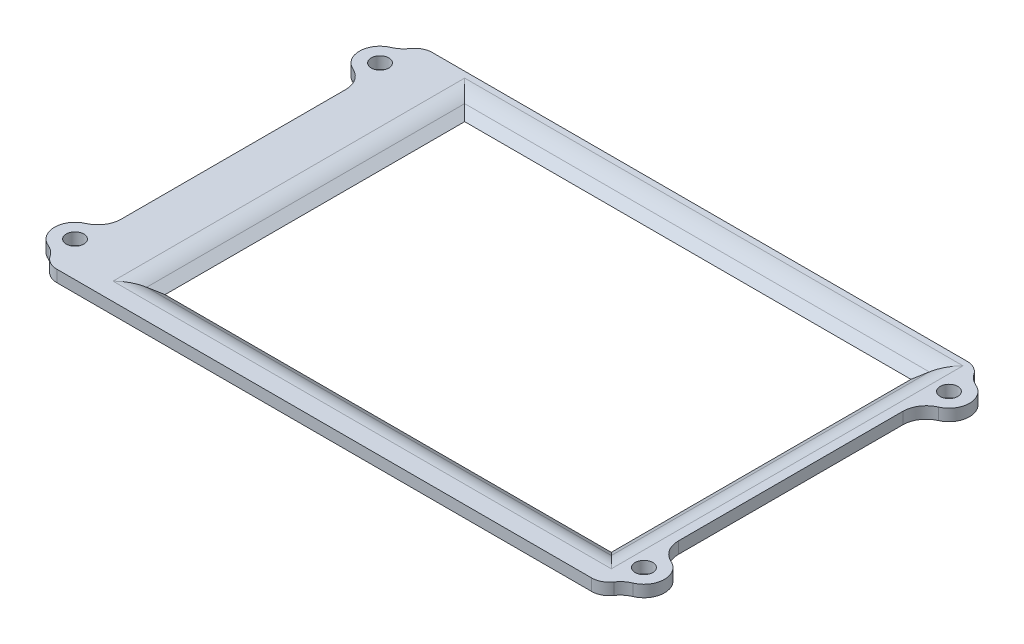
ISO-10303-21;
HEADER;
FILE_DESCRIPTION(('STEP AP214'),'2;1');
FILE_NAME('part.step','',(''),(''),'','','');
FILE_SCHEMA(('AUTOMOTIVE_DESIGN { 1 0 10303 214 1 1 1 1 }'));
ENDSEC;
DATA;
#1=APPLICATION_CONTEXT('core data for automotive mechanical design processes');
#2=APPLICATION_PROTOCOL_DEFINITION('international standard','automotive_design',2000,#1);
#3=PRODUCT_CONTEXT('',#1,'mechanical');
#4=PRODUCT('Part','Part','',(#3));
#5=PRODUCT_RELATED_PRODUCT_CATEGORY('part','',(#4));
#6=PRODUCT_DEFINITION_FORMATION('','',#4);
#7=PRODUCT_DEFINITION_CONTEXT('part definition',#1,'design');
#8=PRODUCT_DEFINITION('design','',#6,#7);
#9=PRODUCT_DEFINITION_SHAPE('','',#8);
#10=(LENGTH_UNIT() NAMED_UNIT(*) SI_UNIT(.MILLI.,.METRE.));
#11=(NAMED_UNIT(*) PLANE_ANGLE_UNIT() SI_UNIT($,.RADIAN.));
#12=(NAMED_UNIT(*) SI_UNIT($,.STERADIAN.) SOLID_ANGLE_UNIT());
#13=UNCERTAINTY_MEASURE_WITH_UNIT(LENGTH_MEASURE(1.E-05),#10,'distance_accuracy_value','');
#14=(GEOMETRIC_REPRESENTATION_CONTEXT(3) GLOBAL_UNCERTAINTY_ASSIGNED_CONTEXT((#13)) GLOBAL_UNIT_ASSIGNED_CONTEXT((#10,
#11,#12)) REPRESENTATION_CONTEXT('',''));
#15=CARTESIAN_POINT('',(0.,0.,0.));
#16=DIRECTION('',(0.,0.,1.));
#17=DIRECTION('',(1.,0.,0.));
#18=AXIS2_PLACEMENT_3D('',#15,#16,#17);
#19=CARTESIAN_POINT('',(47.5,2.,32.));
#20=DIRECTION('',(-1.,0.,0.));
#21=DIRECTION('',(0.,0.,1.));
#22=AXIS2_PLACEMENT_3D('',#19,#20,#21);
#23=PLANE('',#22);
#24=DIRECTION('',(0.,0.,-1.));
#25=VECTOR('',#24,1.);
#26=CARTESIAN_POINT('',(47.5,0.,32.));
#27=LINE('',#26,#25);
#28=CARTESIAN_POINT('',(47.5,0.,19.1261364575662));
#29=VERTEX_POINT('',#28);
#30=CARTESIAN_POINT('',(47.5,0.,-19.1261364575663));
#31=VERTEX_POINT('',#30);
#32=EDGE_CURVE('E242',#29,#31,#27,.T.);
#33=ORIENTED_EDGE('',*,*,#32,.T.);
#34=DIRECTION('',(0.,1.,0.));
#35=VECTOR('',#34,1.);
#36=CARTESIAN_POINT('',(47.5,2.,-19.1261364575663));
#37=LINE('',#36,#35);
#38=CARTESIAN_POINT('',(47.5,2.,-19.1261364575663));
#39=VERTEX_POINT('',#38);
#40=EDGE_CURVE('E265',#31,#39,#37,.T.);
#41=ORIENTED_EDGE('',*,*,#40,.T.);
#42=DIRECTION('',(0.,0.,-1.));
#43=VECTOR('',#42,1.);
#44=CARTESIAN_POINT('',(47.5,2.,32.));
#45=LINE('',#44,#43);
#46=CARTESIAN_POINT('',(47.5,2.,19.1261364575662));
#47=VERTEX_POINT('',#46);
#48=EDGE_CURVE('E466',#47,#39,#45,.T.);
#49=ORIENTED_EDGE('',*,*,#48,.F.);
#50=DIRECTION('',(0.,1.,0.));
#51=VECTOR('',#50,1.);
#52=CARTESIAN_POINT('',(47.5,2.,19.1261364575662));
#53=LINE('',#52,#51);
#54=EDGE_CURVE('E262',#47,#29,#53,.F.);
#55=ORIENTED_EDGE('',*,*,#54,.T.);
#56=EDGE_LOOP('',(#33,#41,#49,#55));
#57=FACE_BOUND('',#56,.T.);
#58=ADVANCED_FACE('F33',(#57),#23,.F.);
#59=CARTESIAN_POINT('',(-47.5,2.,32.));
#60=DIRECTION('',(1.,0.,0.));
#61=DIRECTION('',(0.,0.,-1.));
#62=AXIS2_PLACEMENT_3D('',#59,#60,#61);
#63=PLANE('',#62);
#64=DIRECTION('',(0.,0.,1.));
#65=VECTOR('',#64,1.);
#66=CARTESIAN_POINT('',(-47.5,0.,32.));
#67=LINE('',#66,#65);
#68=CARTESIAN_POINT('',(-47.5,0.,-19.1261364575662));
#69=VERTEX_POINT('',#68);
#70=CARTESIAN_POINT('',(-47.5,0.,19.1261364575662));
#71=VERTEX_POINT('',#70);
#72=EDGE_CURVE('E226',#69,#71,#67,.T.);
#73=ORIENTED_EDGE('',*,*,#72,.T.);
#74=DIRECTION('',(0.,1.,0.));
#75=VECTOR('',#74,1.);
#76=CARTESIAN_POINT('',(-47.5,2.,19.1261364575662));
#77=LINE('',#76,#75);
#78=CARTESIAN_POINT('',(-47.5,2.,19.1261364575662));
#79=VERTEX_POINT('',#78);
#80=EDGE_CURVE('E230',#71,#79,#77,.T.);
#81=ORIENTED_EDGE('',*,*,#80,.T.);
#82=DIRECTION('',(0.,0.,1.));
#83=VECTOR('',#82,1.);
#84=CARTESIAN_POINT('',(-47.5,2.,32.));
#85=LINE('',#84,#83);
#86=CARTESIAN_POINT('',(-47.5,2.,-19.1261364575662));
#87=VERTEX_POINT('',#86);
#88=EDGE_CURVE('E229',#87,#79,#85,.T.);
#89=ORIENTED_EDGE('',*,*,#88,.F.);
#90=DIRECTION('',(0.,1.,0.));
#91=VECTOR('',#90,1.);
#92=CARTESIAN_POINT('',(-47.5,2.,-19.1261364575662));
#93=LINE('',#92,#91);
#94=EDGE_CURVE('E212',#87,#69,#93,.F.);
#95=ORIENTED_EDGE('',*,*,#94,.T.);
#96=EDGE_LOOP('',(#73,#81,#89,#95));
#97=FACE_BOUND('',#96,.T.);
#98=ADVANCED_FACE('F224',(#97),#63,.F.);
#99=CARTESIAN_POINT('',(47.5,2.,32.));
#100=DIRECTION('',(0.,0.,-1.));
#101=DIRECTION('',(-1.,0.,0.));
#102=AXIS2_PLACEMENT_3D('',#99,#100,#101);
#103=PLANE('',#102);
#104=DIRECTION('',(1.,0.,0.));
#105=VECTOR('',#104,1.);
#106=CARTESIAN_POINT('',(47.5,0.,32.));
#107=LINE('',#106,#105);
#108=CARTESIAN_POINT('',(-45.593156546014,0.,32.));
#109=VERTEX_POINT('',#108);
#110=CARTESIAN_POINT('',(45.593156546014,0.,32.));
#111=VERTEX_POINT('',#110);
#112=EDGE_CURVE('E238',#109,#111,#107,.T.);
#113=ORIENTED_EDGE('',*,*,#112,.T.);
#114=DIRECTION('',(0.,-1.,0.));
#115=VECTOR('',#114,1.);
#116=CARTESIAN_POINT('',(45.593156546014,2.,32.));
#117=LINE('',#116,#115);
#118=CARTESIAN_POINT('',(45.593156546014,2.,32.));
#119=VERTEX_POINT('',#118);
#120=EDGE_CURVE('E336',#111,#119,#117,.F.);
#121=ORIENTED_EDGE('',*,*,#120,.T.);
#122=DIRECTION('',(1.,0.,0.));
#123=VECTOR('',#122,1.);
#124=CARTESIAN_POINT('',(47.5,2.,32.));
#125=LINE('',#124,#123);
#126=CARTESIAN_POINT('',(-45.593156546014,2.,32.));
#127=VERTEX_POINT('',#126);
#128=EDGE_CURVE('E464',#127,#119,#125,.T.);
#129=ORIENTED_EDGE('',*,*,#128,.F.);
#130=DIRECTION('',(0.,1.,0.));
#131=VECTOR('',#130,1.);
#132=CARTESIAN_POINT('',(-45.593156546014,2.,32.));
#133=LINE('',#132,#131);
#134=EDGE_CURVE('E333',#127,#109,#133,.F.);
#135=ORIENTED_EDGE('',*,*,#134,.T.);
#136=EDGE_LOOP('',(#113,#121,#129,#135));
#137=FACE_BOUND('',#136,.T.);
#138=ADVANCED_FACE('F533',(#137),#103,.F.);
#139=CARTESIAN_POINT('',(47.5,2.,-32.));
#140=DIRECTION('',(0.,0.,1.));
#141=DIRECTION('',(1.,0.,0.));
#142=AXIS2_PLACEMENT_3D('',#139,#140,#141);
#143=PLANE('',#142);
#144=DIRECTION('',(-1.,0.,0.));
#145=VECTOR('',#144,1.);
#146=CARTESIAN_POINT('',(47.5,2.,-32.));
#147=LINE('',#146,#145);
#148=CARTESIAN_POINT('',(45.593156546014,2.,-32.));
#149=VERTEX_POINT('',#148);
#150=CARTESIAN_POINT('',(-45.5931565460141,2.,-32.));
#151=VERTEX_POINT('',#150);
#152=EDGE_CURVE('E231',#149,#151,#147,.T.);
#153=ORIENTED_EDGE('',*,*,#152,.F.);
#154=DIRECTION('',(0.,1.,0.));
#155=VECTOR('',#154,1.);
#156=CARTESIAN_POINT('',(45.593156546014,2.,-32.));
#157=LINE('',#156,#155);
#158=CARTESIAN_POINT('',(45.593156546014,0.,-32.));
#159=VERTEX_POINT('',#158);
#160=EDGE_CURVE('E309',#149,#159,#157,.F.);
#161=ORIENTED_EDGE('',*,*,#160,.T.);
#162=DIRECTION('',(-1.,0.,0.));
#163=VECTOR('',#162,1.);
#164=CARTESIAN_POINT('',(47.5,0.,-32.));
#165=LINE('',#164,#163);
#166=CARTESIAN_POINT('',(-45.5931565460141,0.,-32.));
#167=VERTEX_POINT('',#166);
#168=EDGE_CURVE('E251',#159,#167,#165,.T.);
#169=ORIENTED_EDGE('',*,*,#168,.T.);
#170=DIRECTION('',(0.,-1.,0.));
#171=VECTOR('',#170,1.);
#172=CARTESIAN_POINT('',(-45.5931565460141,2.,-32.));
#173=LINE('',#172,#171);
#174=EDGE_CURVE('E307',#167,#151,#173,.F.);
#175=ORIENTED_EDGE('',*,*,#174,.T.);
#176=EDGE_LOOP('',(#153,#161,#169,#175));
#177=FACE_BOUND('',#176,.T.);
#178=ADVANCED_FACE('F411',(#177),#143,.F.);
#179=CARTESIAN_POINT('',(0.,2.,0.));
#180=DIRECTION('',(0.,1.,0.));
#181=DIRECTION('',(0.,0.,1.));
#182=AXIS2_PLACEMENT_3D('',#179,#180,#181);
#183=PLANE('',#182);
#184=DIRECTION('',(1.,0.,0.));
#185=VECTOR('',#184,1.);
#186=CARTESIAN_POINT('',(0.,2.,-30.9781512578093));
#187=LINE('',#186,#185);
#188=CARTESIAN_POINT('',(-39.0473551123345,2.,-30.9781512578093));
#189=VERTEX_POINT('',#188);
#190=CARTESIAN_POINT('',(45.9056327764554,2.,-30.9781512578093));
#191=VERTEX_POINT('',#190);
#192=EDGE_CURVE('E366',#189,#191,#187,.T.);
#193=ORIENTED_EDGE('',*,*,#192,.T.);
#194=DIRECTION('',(0.,0.,1.));
#195=VECTOR('',#194,1.);
#196=CARTESIAN_POINT('',(45.9056327764554,2.,0.));
#197=LINE('',#196,#195);
#198=CARTESIAN_POINT('',(45.9056327764554,2.,28.9748366309806));
#199=VERTEX_POINT('',#198);
#200=EDGE_CURVE('E368',#191,#199,#197,.T.);
#201=ORIENTED_EDGE('',*,*,#200,.T.);
#202=DIRECTION('',(-1.,0.,0.));
#203=VECTOR('',#202,1.);
#204=CARTESIAN_POINT('',(0.,2.,28.9748366309806));
#205=LINE('',#204,#203);
#206=CARTESIAN_POINT('',(-39.0473551123345,2.,28.9748366309806));
#207=VERTEX_POINT('',#206);
#208=EDGE_CURVE('E353',#199,#207,#205,.T.);
#209=ORIENTED_EDGE('',*,*,#208,.T.);
#210=DIRECTION('',(0.,0.,-1.));
#211=VECTOR('',#210,1.);
#212=CARTESIAN_POINT('',(-39.0473551123345,2.,0.));
#213=LINE('',#212,#211);
#214=EDGE_CURVE('E364',#207,#189,#213,.T.);
#215=ORIENTED_EDGE('',*,*,#214,.T.);
#216=EDGE_LOOP('',(#193,#201,#209,#215));
#217=FACE_BOUND('',#216,.T.);
#218=CARTESIAN_POINT('',(48.5,2.,-26.));
#219=DIRECTION('',(0.,1.,0.));
#220=DIRECTION('',(0.,0.,1.));
#221=AXIS2_PLACEMENT_3D('',#218,#219,#220);
#222=CIRCLE('',#221,1.5);
#223=CARTESIAN_POINT('',(48.5,2.,-24.5));
#224=VERTEX_POINT('',#223);
#225=EDGE_CURVE('E416',#224,#224,#222,.T.);
#226=ORIENTED_EDGE('',*,*,#225,.F.);
#227=EDGE_LOOP('',(#226));
#228=FACE_BOUND('',#227,.T.);
#229=CARTESIAN_POINT('',(-48.5,2.,-26.));
#230=DIRECTION('',(0.,1.,0.));
#231=DIRECTION('',(0.,0.,1.));
#232=AXIS2_PLACEMENT_3D('',#229,#230,#231);
#233=CIRCLE('',#232,1.5);
#234=CARTESIAN_POINT('',(-48.5,2.,-24.5));
#235=VERTEX_POINT('',#234);
#236=EDGE_CURVE('E420',#235,#235,#233,.T.);
#237=ORIENTED_EDGE('',*,*,#236,.F.);
#238=EDGE_LOOP('',(#237));
#239=FACE_BOUND('',#238,.T.);
#240=CARTESIAN_POINT('',(-48.5,2.,26.));
#241=DIRECTION('',(0.,1.,0.));
#242=DIRECTION('',(0.,0.,1.));
#243=AXIS2_PLACEMENT_3D('',#240,#241,#242);
#244=CIRCLE('',#243,1.5);
#245=CARTESIAN_POINT('',(-48.5,2.,27.5));
#246=VERTEX_POINT('',#245);
#247=EDGE_CURVE('E362',#246,#246,#244,.T.);
#248=ORIENTED_EDGE('',*,*,#247,.F.);
#249=EDGE_LOOP('',(#248));
#250=FACE_BOUND('',#249,.T.);
#251=CARTESIAN_POINT('',(48.5,2.,26.));
#252=DIRECTION('',(0.,1.,0.));
#253=DIRECTION('',(0.,0.,1.));
#254=AXIS2_PLACEMENT_3D('',#251,#252,#253);
#255=CIRCLE('',#254,1.5);
#256=CARTESIAN_POINT('',(48.5,2.,27.5));
#257=VERTEX_POINT('',#256);
#258=EDGE_CURVE('E427',#257,#257,#255,.T.);
#259=ORIENTED_EDGE('',*,*,#258,.F.);
#260=EDGE_LOOP('',(#259));
#261=FACE_BOUND('',#260,.T.);
#262=CARTESIAN_POINT('',(51.3928472915339,2.,-32.9196412152557));
#263=DIRECTION('',(0.,1.,0.));
#264=DIRECTION('',(0.,0.,1.));
#265=AXIS2_PLACEMENT_3D('',#262,#263,#264);
#266=CIRCLE('',#265,4.);
#267=CARTESIAN_POINT('',(49.8499954027158,2.,-29.2291659004527));
#268=VERTEX_POINT('',#267);
#269=CARTESIAN_POINT('',(48.078738294094,2.,-30.6798462351096));
#270=VERTEX_POINT('',#269);
#271=EDGE_CURVE('E295',#268,#270,#266,.F.);
#272=ORIENTED_EDGE('',*,*,#271,.T.);
#273=CARTESIAN_POINT('',(45.593156546014,2.,-29.));
#274=DIRECTION('',(0.,1.,0.));
#275=DIRECTION('',(0.,0.,1.));
#276=AXIS2_PLACEMENT_3D('',#273,#274,#275);
#277=CIRCLE('',#276,3.);
#278=EDGE_CURVE('E328',#270,#149,#277,.T.);
#279=ORIENTED_EDGE('',*,*,#278,.T.);
#280=ORIENTED_EDGE('',*,*,#152,.T.);
#281=CARTESIAN_POINT('',(-45.5931565460141,2.,-29.));
#282=DIRECTION('',(0.,1.,0.));
#283=DIRECTION('',(0.,0.,1.));
#284=AXIS2_PLACEMENT_3D('',#281,#282,#283);
#285=CIRCLE('',#284,3.);
#286=CARTESIAN_POINT('',(-48.078738294094,2.,-30.6798462351096));
#287=VERTEX_POINT('',#286);
#288=EDGE_CURVE('E322',#151,#287,#285,.T.);
#289=ORIENTED_EDGE('',*,*,#288,.T.);
#290=CARTESIAN_POINT('',(-51.3928472915339,2.,-32.9196412152557));
#291=DIRECTION('',(0.,1.,0.));
#292=DIRECTION('',(0.,0.,1.));
#293=AXIS2_PLACEMENT_3D('',#290,#291,#292);
#294=CIRCLE('',#293,4.);
#295=CARTESIAN_POINT('',(-49.8499954027158,2.,-29.2291659004527));
#296=VERTEX_POINT('',#295);
#297=EDGE_CURVE('E284',#287,#296,#294,.F.);
#298=ORIENTED_EDGE('',*,*,#297,.T.);
#299=CARTESIAN_POINT('',(-48.5,2.,-26.));
#300=DIRECTION('',(0.,1.,0.));
#301=DIRECTION('',(0.,0.,1.));
#302=AXIS2_PLACEMENT_3D('',#299,#300,#301);
#303=CIRCLE('',#302,3.5);
#304=CARTESIAN_POINT('',(-49.9,2.,-22.7921970135309));
#305=VERTEX_POINT('',#304);
#306=EDGE_CURVE('E244',#296,#305,#303,.T.);
#307=ORIENTED_EDGE('',*,*,#306,.T.);
#308=CARTESIAN_POINT('',(-51.5,2.,-19.1261364575662));
#309=DIRECTION('',(0.,1.,0.));
#310=DIRECTION('',(0.,0.,1.));
#311=AXIS2_PLACEMENT_3D('',#308,#309,#310);
#312=CIRCLE('',#311,4.);
#313=EDGE_CURVE('E218',#305,#87,#312,.F.);
#314=ORIENTED_EDGE('',*,*,#313,.T.);
#315=ORIENTED_EDGE('',*,*,#88,.T.);
#316=CARTESIAN_POINT('',(-51.5,2.,19.1261364575662));
#317=DIRECTION('',(0.,1.,0.));
#318=DIRECTION('',(0.,0.,1.));
#319=AXIS2_PLACEMENT_3D('',#316,#317,#318);
#320=CIRCLE('',#319,4.);
#321=CARTESIAN_POINT('',(-49.9,2.,22.7921970135309));
#322=VERTEX_POINT('',#321);
#323=EDGE_CURVE('E276',#79,#322,#320,.F.);
#324=ORIENTED_EDGE('',*,*,#323,.T.);
#325=CARTESIAN_POINT('',(-48.5,2.,26.));
#326=DIRECTION('',(0.,1.,0.));
#327=DIRECTION('',(0.,0.,1.));
#328=AXIS2_PLACEMENT_3D('',#325,#326,#327);
#329=CIRCLE('',#328,3.5);
#330=CARTESIAN_POINT('',(-49.8499954027159,2.,29.2291659004526));
#331=VERTEX_POINT('',#330);
#332=EDGE_CURVE('E459',#322,#331,#329,.T.);
#333=ORIENTED_EDGE('',*,*,#332,.T.);
#334=CARTESIAN_POINT('',(-51.3928472915339,2.,32.9196412152557));
#335=DIRECTION('',(0.,1.,0.));
#336=DIRECTION('',(0.,0.,1.));
#337=AXIS2_PLACEMENT_3D('',#334,#335,#336);
#338=CIRCLE('',#337,4.);
#339=CARTESIAN_POINT('',(-48.078738294094,2.,30.6798462351096));
#340=VERTEX_POINT('',#339);
#341=EDGE_CURVE('E219',#331,#340,#338,.F.);
#342=ORIENTED_EDGE('',*,*,#341,.T.);
#343=CARTESIAN_POINT('',(-45.593156546014,2.,29.));
#344=DIRECTION('',(0.,1.,0.));
#345=DIRECTION('',(0.,0.,1.));
#346=AXIS2_PLACEMENT_3D('',#343,#344,#345);
#347=CIRCLE('',#346,3.);
#348=EDGE_CURVE('E324',#340,#127,#347,.T.);
#349=ORIENTED_EDGE('',*,*,#348,.T.);
#350=ORIENTED_EDGE('',*,*,#128,.T.);
#351=CARTESIAN_POINT('',(45.593156546014,2.,29.));
#352=DIRECTION('',(0.,1.,0.));
#353=DIRECTION('',(0.,0.,1.));
#354=AXIS2_PLACEMENT_3D('',#351,#352,#353);
#355=CIRCLE('',#354,3.);
#356=CARTESIAN_POINT('',(48.078738294094,2.,30.6798462351096));
#357=VERTEX_POINT('',#356);
#358=EDGE_CURVE('E326',#119,#357,#355,.T.);
#359=ORIENTED_EDGE('',*,*,#358,.T.);
#360=CARTESIAN_POINT('',(51.3928472915339,2.,32.9196412152557));
#361=DIRECTION('',(0.,1.,0.));
#362=DIRECTION('',(0.,0.,1.));
#363=AXIS2_PLACEMENT_3D('',#360,#361,#362);
#364=CIRCLE('',#363,4.);
#365=CARTESIAN_POINT('',(49.8499954027158,2.,29.2291659004526));
#366=VERTEX_POINT('',#365);
#367=EDGE_CURVE('E302',#357,#366,#364,.F.);
#368=ORIENTED_EDGE('',*,*,#367,.T.);
#369=CARTESIAN_POINT('',(48.5,2.,26.));
#370=DIRECTION('',(0.,1.,0.));
#371=DIRECTION('',(0.,0.,1.));
#372=AXIS2_PLACEMENT_3D('',#369,#370,#371);
#373=CIRCLE('',#372,3.50000000000001);
#374=CARTESIAN_POINT('',(49.9,2.,22.7921970135309));
#375=VERTEX_POINT('',#374);
#376=EDGE_CURVE('E486',#366,#375,#373,.T.);
#377=ORIENTED_EDGE('',*,*,#376,.T.);
#378=CARTESIAN_POINT('',(51.5,2.,19.1261364575662));
#379=DIRECTION('',(0.,1.,0.));
#380=DIRECTION('',(0.,0.,1.));
#381=AXIS2_PLACEMENT_3D('',#378,#379,#380);
#382=CIRCLE('',#381,4.);
#383=EDGE_CURVE('E300',#375,#47,#382,.F.);
#384=ORIENTED_EDGE('',*,*,#383,.T.);
#385=ORIENTED_EDGE('',*,*,#48,.T.);
#386=CARTESIAN_POINT('',(51.5,2.,-19.1261364575663));
#387=DIRECTION('',(0.,1.,0.));
#388=DIRECTION('',(0.,0.,1.));
#389=AXIS2_PLACEMENT_3D('',#386,#387,#388);
#390=CIRCLE('',#389,4.);
#391=CARTESIAN_POINT('',(49.9,2.,-22.7921970135309));
#392=VERTEX_POINT('',#391);
#393=EDGE_CURVE('E289',#39,#392,#390,.F.);
#394=ORIENTED_EDGE('',*,*,#393,.T.);
#395=CARTESIAN_POINT('',(48.5,2.,-26.));
#396=DIRECTION('',(0.,1.,0.));
#397=DIRECTION('',(0.,0.,1.));
#398=AXIS2_PLACEMENT_3D('',#395,#396,#397);
#399=CIRCLE('',#398,3.5);
#400=EDGE_CURVE('E434',#392,#268,#399,.T.);
#401=ORIENTED_EDGE('',*,*,#400,.T.);
#402=EDGE_LOOP('',(#272,#279,#280,#289,#298,#307,#314,#315,#324,#333,#342,#349,#350,#359,#368,
#377,#384,#385,#394,#401));
#403=FACE_BOUND('',#402,.T.);
#404=ADVANCED_FACE('F408',(#217,#228,#239,#250,#261,#403),#183,.T.);
#405=CARTESIAN_POINT('',(0.,0.,0.));
#406=DIRECTION('',(0.,1.,0.));
#407=DIRECTION('',(0.,0.,1.));
#408=AXIS2_PLACEMENT_3D('',#405,#406,#407);
#409=PLANE('',#408);
#410=DIRECTION('',(-1.,0.,0.));
#411=VECTOR('',#410,1.);
#412=CARTESIAN_POINT('',(-34.4708611679396,0.,-26.5453612999301));
#413=LINE('',#412,#411);
#414=CARTESIAN_POINT('',(41.4728428185762,0.,-26.5453612999301));
#415=VERTEX_POINT('',#414);
#416=CARTESIAN_POINT('',(-34.6145651544554,0.,-26.5453612999301));
#417=VERTEX_POINT('',#416);
#418=EDGE_CURVE('E348',#415,#417,#413,.T.);
#419=ORIENTED_EDGE('',*,*,#418,.T.);
#420=DIRECTION('',(0.,0.,1.));
#421=VECTOR('',#420,1.);
#422=CARTESIAN_POINT('',(-34.6145651544554,0.,24.3983426865857));
#423=LINE('',#422,#421);
#424=CARTESIAN_POINT('',(-34.6145651544554,0.,24.5420466731015));
#425=VERTEX_POINT('',#424);
#426=EDGE_CURVE('E350',#417,#425,#423,.T.);
#427=ORIENTED_EDGE('',*,*,#426,.T.);
#428=DIRECTION('',(1.,0.,0.));
#429=VECTOR('',#428,1.);
#430=CARTESIAN_POINT('',(-34.4708611679396,0.,24.5420466731015));
#431=LINE('',#430,#429);
#432=CARTESIAN_POINT('',(41.4728428185762,0.,24.5420466731015));
#433=VERTEX_POINT('',#432);
#434=EDGE_CURVE('E343',#425,#433,#431,.T.);
#435=ORIENTED_EDGE('',*,*,#434,.T.);
#436=DIRECTION('',(0.,0.,-1.));
#437=VECTOR('',#436,1.);
#438=CARTESIAN_POINT('',(41.4728428185762,0.,24.3983426865857));
#439=LINE('',#438,#437);
#440=EDGE_CURVE('E346',#433,#415,#439,.T.);
#441=ORIENTED_EDGE('',*,*,#440,.T.);
#442=EDGE_LOOP('',(#419,#427,#435,#441));
#443=FACE_BOUND('',#442,.T.);
#444=CARTESIAN_POINT('',(48.5,0.,-26.));
#445=DIRECTION('',(0.,1.,0.));
#446=DIRECTION('',(0.,0.,1.));
#447=AXIS2_PLACEMENT_3D('',#444,#445,#446);
#448=CIRCLE('',#447,1.5);
#449=CARTESIAN_POINT('',(48.5,0.,-24.5));
#450=VERTEX_POINT('',#449);
#451=EDGE_CURVE('E497',#450,#450,#448,.T.);
#452=ORIENTED_EDGE('',*,*,#451,.T.);
#453=EDGE_LOOP('',(#452));
#454=FACE_BOUND('',#453,.T.);
#455=CARTESIAN_POINT('',(-48.5,0.,-26.));
#456=DIRECTION('',(0.,1.,0.));
#457=DIRECTION('',(0.,0.,1.));
#458=AXIS2_PLACEMENT_3D('',#455,#456,#457);
#459=CIRCLE('',#458,1.5);
#460=CARTESIAN_POINT('',(-48.5,0.,-24.5));
#461=VERTEX_POINT('',#460);
#462=EDGE_CURVE('E505',#461,#461,#459,.T.);
#463=ORIENTED_EDGE('',*,*,#462,.T.);
#464=EDGE_LOOP('',(#463));
#465=FACE_BOUND('',#464,.T.);
#466=CARTESIAN_POINT('',(-48.5,0.,26.));
#467=DIRECTION('',(0.,1.,0.));
#468=DIRECTION('',(0.,0.,1.));
#469=AXIS2_PLACEMENT_3D('',#466,#467,#468);
#470=CIRCLE('',#469,1.5);
#471=CARTESIAN_POINT('',(-48.5,0.,27.5));
#472=VERTEX_POINT('',#471);
#473=EDGE_CURVE('E501',#472,#472,#470,.T.);
#474=ORIENTED_EDGE('',*,*,#473,.T.);
#475=EDGE_LOOP('',(#474));
#476=FACE_BOUND('',#475,.T.);
#477=CARTESIAN_POINT('',(48.5,0.,26.));
#478=DIRECTION('',(0.,1.,0.));
#479=DIRECTION('',(0.,0.,1.));
#480=AXIS2_PLACEMENT_3D('',#477,#478,#479);
#481=CIRCLE('',#480,1.5);
#482=CARTESIAN_POINT('',(48.5,0.,27.5));
#483=VERTEX_POINT('',#482);
#484=EDGE_CURVE('E495',#483,#483,#481,.T.);
#485=ORIENTED_EDGE('',*,*,#484,.T.);
#486=EDGE_LOOP('',(#485));
#487=FACE_BOUND('',#486,.T.);
#488=ORIENTED_EDGE('',*,*,#168,.F.);
#489=CARTESIAN_POINT('',(45.593156546014,0.,-29.));
#490=DIRECTION('',(0.,1.,0.));
#491=DIRECTION('',(0.,0.,1.));
#492=AXIS2_PLACEMENT_3D('',#489,#490,#491);
#493=CIRCLE('',#492,3.);
#494=CARTESIAN_POINT('',(48.078738294094,0.,-30.6798462351096));
#495=VERTEX_POINT('',#494);
#496=EDGE_CURVE('E318',#159,#495,#493,.F.);
#497=ORIENTED_EDGE('',*,*,#496,.T.);
#498=CARTESIAN_POINT('',(51.3928472915339,0.,-32.9196412152557));
#499=DIRECTION('',(0.,1.,0.));
#500=DIRECTION('',(0.,0.,1.));
#501=AXIS2_PLACEMENT_3D('',#498,#499,#500);
#502=CIRCLE('',#501,4.);
#503=CARTESIAN_POINT('',(49.8499954027158,0.,-29.2291659004527));
#504=VERTEX_POINT('',#503);
#505=EDGE_CURVE('E293',#495,#504,#502,.T.);
#506=ORIENTED_EDGE('',*,*,#505,.T.);
#507=CARTESIAN_POINT('',(48.5,0.,-26.));
#508=DIRECTION('',(0.,1.,0.));
#509=DIRECTION('',(0.,0.,1.));
#510=AXIS2_PLACEMENT_3D('',#507,#508,#509);
#511=CIRCLE('',#510,3.5);
#512=CARTESIAN_POINT('',(49.9,0.,-22.7921970135309));
#513=VERTEX_POINT('',#512);
#514=EDGE_CURVE('E489',#504,#513,#511,.F.);
#515=ORIENTED_EDGE('',*,*,#514,.T.);
#516=CARTESIAN_POINT('',(51.5,0.,-19.1261364575663));
#517=DIRECTION('',(0.,1.,0.));
#518=DIRECTION('',(0.,0.,1.));
#519=AXIS2_PLACEMENT_3D('',#516,#517,#518);
#520=CIRCLE('',#519,4.);
#521=EDGE_CURVE('E291',#513,#31,#520,.T.);
#522=ORIENTED_EDGE('',*,*,#521,.T.);
#523=ORIENTED_EDGE('',*,*,#32,.F.);
#524=CARTESIAN_POINT('',(51.5,0.,19.1261364575662));
#525=DIRECTION('',(0.,1.,0.));
#526=DIRECTION('',(0.,0.,1.));
#527=AXIS2_PLACEMENT_3D('',#524,#525,#526);
#528=CIRCLE('',#527,4.);
#529=CARTESIAN_POINT('',(49.9,0.,22.7921970135309));
#530=VERTEX_POINT('',#529);
#531=EDGE_CURVE('E298',#29,#530,#528,.T.);
#532=ORIENTED_EDGE('',*,*,#531,.T.);
#533=CARTESIAN_POINT('',(48.5,0.,26.));
#534=DIRECTION('',(0.,1.,0.));
#535=DIRECTION('',(0.,0.,1.));
#536=AXIS2_PLACEMENT_3D('',#533,#534,#535);
#537=CIRCLE('',#536,3.50000000000001);
#538=CARTESIAN_POINT('',(49.8499954027158,0.,29.2291659004526));
#539=VERTEX_POINT('',#538);
#540=EDGE_CURVE('E480',#530,#539,#537,.F.);
#541=ORIENTED_EDGE('',*,*,#540,.T.);
#542=CARTESIAN_POINT('',(51.3928472915339,0.,32.9196412152557));
#543=DIRECTION('',(0.,1.,0.));
#544=DIRECTION('',(0.,0.,1.));
#545=AXIS2_PLACEMENT_3D('',#542,#543,#544);
#546=CIRCLE('',#545,4.);
#547=CARTESIAN_POINT('',(48.078738294094,0.,30.6798462351096));
#548=VERTEX_POINT('',#547);
#549=EDGE_CURVE('E304',#539,#548,#546,.T.);
#550=ORIENTED_EDGE('',*,*,#549,.T.);
#551=CARTESIAN_POINT('',(45.593156546014,0.,29.));
#552=DIRECTION('',(0.,1.,0.));
#553=DIRECTION('',(0.,0.,1.));
#554=AXIS2_PLACEMENT_3D('',#551,#552,#553);
#555=CIRCLE('',#554,3.);
#556=EDGE_CURVE('E316',#548,#111,#555,.F.);
#557=ORIENTED_EDGE('',*,*,#556,.T.);
#558=ORIENTED_EDGE('',*,*,#112,.F.);
#559=CARTESIAN_POINT('',(-45.593156546014,0.,29.));
#560=DIRECTION('',(0.,1.,0.));
#561=DIRECTION('',(0.,0.,1.));
#562=AXIS2_PLACEMENT_3D('',#559,#560,#561);
#563=CIRCLE('',#562,3.);
#564=CARTESIAN_POINT('',(-48.078738294094,0.,30.6798462351096));
#565=VERTEX_POINT('',#564);
#566=EDGE_CURVE('E314',#109,#565,#563,.F.);
#567=ORIENTED_EDGE('',*,*,#566,.T.);
#568=CARTESIAN_POINT('',(-51.3928472915339,0.,32.9196412152557));
#569=DIRECTION('',(0.,1.,0.));
#570=DIRECTION('',(0.,0.,1.));
#571=AXIS2_PLACEMENT_3D('',#568,#569,#570);
#572=CIRCLE('',#571,4.);
#573=CARTESIAN_POINT('',(-49.8499954027159,0.,29.2291659004526));
#574=VERTEX_POINT('',#573);
#575=EDGE_CURVE('E279',#565,#574,#572,.T.);
#576=ORIENTED_EDGE('',*,*,#575,.T.);
#577=CARTESIAN_POINT('',(-48.5,0.,26.));
#578=DIRECTION('',(0.,1.,0.));
#579=DIRECTION('',(0.,0.,1.));
#580=AXIS2_PLACEMENT_3D('',#577,#578,#579);
#581=CIRCLE('',#580,3.5);
#582=CARTESIAN_POINT('',(-49.9,0.,22.7921970135309));
#583=VERTEX_POINT('',#582);
#584=EDGE_CURVE('E457',#574,#583,#581,.F.);
#585=ORIENTED_EDGE('',*,*,#584,.T.);
#586=CARTESIAN_POINT('',(-51.5,0.,19.1261364575662));
#587=DIRECTION('',(0.,1.,0.));
#588=DIRECTION('',(0.,0.,1.));
#589=AXIS2_PLACEMENT_3D('',#586,#587,#588);
#590=CIRCLE('',#589,4.);
#591=EDGE_CURVE('E237',#583,#71,#590,.T.);
#592=ORIENTED_EDGE('',*,*,#591,.T.);
#593=ORIENTED_EDGE('',*,*,#72,.F.);
#594=CARTESIAN_POINT('',(-51.5,0.,-19.1261364575662));
#595=DIRECTION('',(0.,1.,0.));
#596=DIRECTION('',(0.,0.,1.));
#597=AXIS2_PLACEMENT_3D('',#594,#595,#596);
#598=CIRCLE('',#597,4.);
#599=CARTESIAN_POINT('',(-49.9,0.,-22.7921970135309));
#600=VERTEX_POINT('',#599);
#601=EDGE_CURVE('E208',#69,#600,#598,.T.);
#602=ORIENTED_EDGE('',*,*,#601,.T.);
#603=CARTESIAN_POINT('',(-48.5,0.,-26.));
#604=DIRECTION('',(0.,1.,0.));
#605=DIRECTION('',(0.,0.,1.));
#606=AXIS2_PLACEMENT_3D('',#603,#604,#605);
#607=CIRCLE('',#606,3.5);
#608=CARTESIAN_POINT('',(-49.8499954027158,0.,-29.2291659004527));
#609=VERTEX_POINT('',#608);
#610=EDGE_CURVE('E239',#600,#609,#607,.F.);
#611=ORIENTED_EDGE('',*,*,#610,.T.);
#612=CARTESIAN_POINT('',(-51.3928472915339,0.,-32.9196412152557));
#613=DIRECTION('',(0.,1.,0.));
#614=DIRECTION('',(0.,0.,1.));
#615=AXIS2_PLACEMENT_3D('',#612,#613,#614);
#616=CIRCLE('',#615,4.);
#617=CARTESIAN_POINT('',(-48.078738294094,0.,-30.6798462351096));
#618=VERTEX_POINT('',#617);
#619=EDGE_CURVE('E286',#609,#618,#616,.T.);
#620=ORIENTED_EDGE('',*,*,#619,.T.);
#621=CARTESIAN_POINT('',(-45.5931565460141,0.,-29.));
#622=DIRECTION('',(0.,1.,0.));
#623=DIRECTION('',(0.,0.,1.));
#624=AXIS2_PLACEMENT_3D('',#621,#622,#623);
#625=CIRCLE('',#624,3.);
#626=EDGE_CURVE('E312',#618,#167,#625,.F.);
#627=ORIENTED_EDGE('',*,*,#626,.T.);
#628=EDGE_LOOP('',(#488,#497,#506,#515,#522,#523,#532,#541,#550,#557,#558,#567,#576,#585,#592,
#593,#602,#611,#620,#627));
#629=FACE_BOUND('',#628,.T.);
#630=ADVANCED_FACE('F234',(#443,#454,#465,#476,#487,#629),#409,.F.);
#631=CARTESIAN_POINT('',(-48.5,-9.89949493661169,-26.));
#632=DIRECTION('',(0.,1.,0.));
#633=DIRECTION('',(0.,0.,1.));
#634=AXIS2_PLACEMENT_3D('',#631,#632,#633);
#635=CYLINDRICAL_SURFACE('',#634,3.5);
#636=ORIENTED_EDGE('',*,*,#610,.F.);
#637=DIRECTION('',(0.,1.,0.));
#638=VECTOR('',#637,1.);
#639=CARTESIAN_POINT('',(-49.9,-9.89949493661169,-22.7921970135309));
#640=LINE('',#639,#638);
#641=EDGE_CURVE('E213',#600,#305,#640,.T.);
#642=ORIENTED_EDGE('',*,*,#641,.T.);
#643=ORIENTED_EDGE('',*,*,#306,.F.);
#644=DIRECTION('',(0.,1.,0.));
#645=VECTOR('',#644,1.);
#646=CARTESIAN_POINT('',(-49.8499954027158,-9.89949493661169,-29.2291659004527));
#647=LINE('',#646,#645);
#648=EDGE_CURVE('E259',#296,#609,#647,.F.);
#649=ORIENTED_EDGE('',*,*,#648,.T.);
#650=EDGE_LOOP('',(#636,#642,#643,#649));
#651=FACE_BOUND('',#650,.T.);
#652=ADVANCED_FACE('F456',(#651),#635,.T.);
#653=CARTESIAN_POINT('',(-48.5,-9.89949493661169,26.));
#654=DIRECTION('',(0.,1.,0.));
#655=DIRECTION('',(0.,0.,1.));
#656=AXIS2_PLACEMENT_3D('',#653,#654,#655);
#657=CYLINDRICAL_SURFACE('',#656,3.5);
#658=ORIENTED_EDGE('',*,*,#332,.F.);
#659=DIRECTION('',(0.,1.,0.));
#660=VECTOR('',#659,1.);
#661=CARTESIAN_POINT('',(-49.9,-9.89949493661169,22.7921970135309));
#662=LINE('',#661,#660);
#663=EDGE_CURVE('E257',#322,#583,#662,.F.);
#664=ORIENTED_EDGE('',*,*,#663,.T.);
#665=ORIENTED_EDGE('',*,*,#584,.F.);
#666=DIRECTION('',(0.,1.,0.));
#667=VECTOR('',#666,1.);
#668=CARTESIAN_POINT('',(-49.8499954027159,-9.89949493661169,29.2291659004526));
#669=LINE('',#668,#667);
#670=EDGE_CURVE('E255',#574,#331,#669,.T.);
#671=ORIENTED_EDGE('',*,*,#670,.T.);
#672=EDGE_LOOP('',(#658,#664,#665,#671));
#673=FACE_BOUND('',#672,.T.);
#674=ADVANCED_FACE('F763',(#673),#657,.T.);
#675=CARTESIAN_POINT('',(48.5,-9.89949493661169,26.));
#676=DIRECTION('',(0.,1.,0.));
#677=DIRECTION('',(0.,0.,1.));
#678=AXIS2_PLACEMENT_3D('',#675,#676,#677);
#679=CYLINDRICAL_SURFACE('',#678,3.50000000000001);
#680=ORIENTED_EDGE('',*,*,#540,.F.);
#681=DIRECTION('',(0.,1.,0.));
#682=VECTOR('',#681,1.);
#683=CARTESIAN_POINT('',(49.9,-9.89949493661169,22.7921970135309));
#684=LINE('',#683,#682);
#685=EDGE_CURVE('E274',#530,#375,#684,.T.);
#686=ORIENTED_EDGE('',*,*,#685,.T.);
#687=ORIENTED_EDGE('',*,*,#376,.F.);
#688=DIRECTION('',(0.,1.,0.));
#689=VECTOR('',#688,1.);
#690=CARTESIAN_POINT('',(49.8499954027158,-9.89949493661169,29.2291659004526));
#691=LINE('',#690,#689);
#692=EDGE_CURVE('E272',#366,#539,#691,.F.);
#693=ORIENTED_EDGE('',*,*,#692,.T.);
#694=EDGE_LOOP('',(#680,#686,#687,#693));
#695=FACE_BOUND('',#694,.T.);
#696=ADVANCED_FACE('F483',(#695),#679,.T.);
#697=CARTESIAN_POINT('',(48.5,-9.89949493661169,-26.));
#698=DIRECTION('',(0.,1.,0.));
#699=DIRECTION('',(0.,0.,1.));
#700=AXIS2_PLACEMENT_3D('',#697,#698,#699);
#701=CYLINDRICAL_SURFACE('',#700,3.5);
#702=ORIENTED_EDGE('',*,*,#400,.F.);
#703=DIRECTION('',(0.,1.,0.));
#704=VECTOR('',#703,1.);
#705=CARTESIAN_POINT('',(49.9,-9.89949493661169,-22.7921970135309));
#706=LINE('',#705,#704);
#707=EDGE_CURVE('E270',#392,#513,#706,.F.);
#708=ORIENTED_EDGE('',*,*,#707,.T.);
#709=ORIENTED_EDGE('',*,*,#514,.F.);
#710=DIRECTION('',(0.,1.,0.));
#711=VECTOR('',#710,1.);
#712=CARTESIAN_POINT('',(49.8499954027158,-9.89949493661169,-29.2291659004527));
#713=LINE('',#712,#711);
#714=EDGE_CURVE('E268',#504,#268,#713,.T.);
#715=ORIENTED_EDGE('',*,*,#714,.T.);
#716=EDGE_LOOP('',(#702,#708,#709,#715));
#717=FACE_BOUND('',#716,.T.);
#718=ADVANCED_FACE('F545',(#717),#701,.T.);
#719=CARTESIAN_POINT('',(-51.5,-9.89949493661169,19.1261364575662));
#720=DIRECTION('',(0.,1.,0.));
#721=DIRECTION('',(0.,0.,1.));
#722=AXIS2_PLACEMENT_3D('',#719,#720,#721);
#723=CYLINDRICAL_SURFACE('',#722,4.);
#724=ORIENTED_EDGE('',*,*,#591,.F.);
#725=ORIENTED_EDGE('',*,*,#663,.F.);
#726=ORIENTED_EDGE('',*,*,#323,.F.);
#727=ORIENTED_EDGE('',*,*,#80,.F.);
#728=EDGE_LOOP('',(#724,#725,#726,#727));
#729=FACE_BOUND('',#728,.T.);
#730=ADVANCED_FACE('F541',(#729),#723,.F.);
#731=CARTESIAN_POINT('',(-51.3928472915339,-9.89949493661169,32.9196412152557));
#732=DIRECTION('',(0.,1.,0.));
#733=DIRECTION('',(0.,0.,1.));
#734=AXIS2_PLACEMENT_3D('',#731,#732,#733);
#735=CYLINDRICAL_SURFACE('',#734,4.);
#736=ORIENTED_EDGE('',*,*,#575,.F.);
#737=DIRECTION('',(0.,1.,0.));
#738=VECTOR('',#737,1.);
#739=CARTESIAN_POINT('',(-48.078738294094,-9.89949493661169,30.6798462351096));
#740=LINE('',#739,#738);
#741=EDGE_CURVE('E338',#565,#340,#740,.T.);
#742=ORIENTED_EDGE('',*,*,#741,.T.);
#743=ORIENTED_EDGE('',*,*,#341,.F.);
#744=ORIENTED_EDGE('',*,*,#670,.F.);
#745=EDGE_LOOP('',(#736,#742,#743,#744));
#746=FACE_BOUND('',#745,.T.);
#747=ADVANCED_FACE('F544',(#746),#735,.F.);
#748=CARTESIAN_POINT('',(-51.5,-9.89949493661169,-19.1261364575662));
#749=DIRECTION('',(0.,1.,0.));
#750=DIRECTION('',(0.,0.,1.));
#751=AXIS2_PLACEMENT_3D('',#748,#749,#750);
#752=CYLINDRICAL_SURFACE('',#751,4.);
#753=ORIENTED_EDGE('',*,*,#313,.F.);
#754=ORIENTED_EDGE('',*,*,#641,.F.);
#755=ORIENTED_EDGE('',*,*,#601,.F.);
#756=ORIENTED_EDGE('',*,*,#94,.F.);
#757=EDGE_LOOP('',(#753,#754,#755,#756));
#758=FACE_BOUND('',#757,.T.);
#759=ADVANCED_FACE('F211',(#758),#752,.F.);
#760=CARTESIAN_POINT('',(-51.3928472915339,-9.89949493661169,-32.9196412152557));
#761=DIRECTION('',(0.,-1.,0.));
#762=DIRECTION('',(0.,0.,-1.));
#763=AXIS2_PLACEMENT_3D('',#760,#761,#762);
#764=CYLINDRICAL_SURFACE('',#763,4.);
#765=ORIENTED_EDGE('',*,*,#297,.F.);
#766=DIRECTION('',(0.,-1.,0.));
#767=VECTOR('',#766,1.);
#768=CARTESIAN_POINT('',(-48.078738294094,-9.89949493661169,-30.6798462351096));
#769=LINE('',#768,#767);
#770=EDGE_CURVE('E340',#287,#618,#769,.T.);
#771=ORIENTED_EDGE('',*,*,#770,.T.);
#772=ORIENTED_EDGE('',*,*,#619,.F.);
#773=ORIENTED_EDGE('',*,*,#648,.F.);
#774=EDGE_LOOP('',(#765,#771,#772,#773));
#775=FACE_BOUND('',#774,.T.);
#776=ADVANCED_FACE('F451',(#775),#764,.F.);
#777=CARTESIAN_POINT('',(51.5,-9.89949493661169,-19.1261364575663));
#778=DIRECTION('',(0.,1.,0.));
#779=DIRECTION('',(0.,0.,1.));
#780=AXIS2_PLACEMENT_3D('',#777,#778,#779);
#781=CYLINDRICAL_SURFACE('',#780,4.);
#782=ORIENTED_EDGE('',*,*,#521,.F.);
#783=ORIENTED_EDGE('',*,*,#707,.F.);
#784=ORIENTED_EDGE('',*,*,#393,.F.);
#785=ORIENTED_EDGE('',*,*,#40,.F.);
#786=EDGE_LOOP('',(#782,#783,#784,#785));
#787=FACE_BOUND('',#786,.T.);
#788=ADVANCED_FACE('F554',(#787),#781,.F.);
#789=CARTESIAN_POINT('',(51.3928472915339,-9.89949493661169,-32.9196412152557));
#790=DIRECTION('',(0.,1.,0.));
#791=DIRECTION('',(0.,0.,1.));
#792=AXIS2_PLACEMENT_3D('',#789,#790,#791);
#793=CYLINDRICAL_SURFACE('',#792,4.);
#794=ORIENTED_EDGE('',*,*,#505,.F.);
#795=DIRECTION('',(0.,1.,0.));
#796=VECTOR('',#795,1.);
#797=CARTESIAN_POINT('',(48.078738294094,-9.89949493661169,-30.6798462351096));
#798=LINE('',#797,#796);
#799=EDGE_CURVE('E320',#495,#270,#798,.T.);
#800=ORIENTED_EDGE('',*,*,#799,.T.);
#801=ORIENTED_EDGE('',*,*,#271,.F.);
#802=ORIENTED_EDGE('',*,*,#714,.F.);
#803=EDGE_LOOP('',(#794,#800,#801,#802));
#804=FACE_BOUND('',#803,.T.);
#805=ADVANCED_FACE('F557',(#804),#793,.F.);
#806=CARTESIAN_POINT('',(51.5,-9.89949493661169,19.1261364575662));
#807=DIRECTION('',(0.,1.,0.));
#808=DIRECTION('',(0.,0.,1.));
#809=AXIS2_PLACEMENT_3D('',#806,#807,#808);
#810=CYLINDRICAL_SURFACE('',#809,4.);
#811=ORIENTED_EDGE('',*,*,#383,.F.);
#812=ORIENTED_EDGE('',*,*,#685,.F.);
#813=ORIENTED_EDGE('',*,*,#531,.F.);
#814=ORIENTED_EDGE('',*,*,#54,.F.);
#815=EDGE_LOOP('',(#811,#812,#813,#814));
#816=FACE_BOUND('',#815,.T.);
#817=ADVANCED_FACE('F476',(#816),#810,.F.);
#818=CARTESIAN_POINT('',(51.3928472915339,-9.89949493661169,32.9196412152557));
#819=DIRECTION('',(0.,-1.,0.));
#820=DIRECTION('',(0.,0.,-1.));
#821=AXIS2_PLACEMENT_3D('',#818,#819,#820);
#822=CYLINDRICAL_SURFACE('',#821,4.);
#823=ORIENTED_EDGE('',*,*,#367,.F.);
#824=DIRECTION('',(0.,-1.,0.));
#825=VECTOR('',#824,1.);
#826=CARTESIAN_POINT('',(48.078738294094,-9.89949493661169,30.6798462351096));
#827=LINE('',#826,#825);
#828=EDGE_CURVE('E330',#357,#548,#827,.T.);
#829=ORIENTED_EDGE('',*,*,#828,.T.);
#830=ORIENTED_EDGE('',*,*,#549,.F.);
#831=ORIENTED_EDGE('',*,*,#692,.F.);
#832=EDGE_LOOP('',(#823,#829,#830,#831));
#833=FACE_BOUND('',#832,.T.);
#834=ADVANCED_FACE('F563',(#833),#822,.F.);
#835=CARTESIAN_POINT('',(45.593156546014,-9.89949493661169,-29.));
#836=DIRECTION('',(0.,1.,0.));
#837=DIRECTION('',(0.,0.,1.));
#838=AXIS2_PLACEMENT_3D('',#835,#836,#837);
#839=CYLINDRICAL_SURFACE('',#838,3.);
#840=ORIENTED_EDGE('',*,*,#278,.F.);
#841=ORIENTED_EDGE('',*,*,#799,.F.);
#842=ORIENTED_EDGE('',*,*,#496,.F.);
#843=ORIENTED_EDGE('',*,*,#160,.F.);
#844=EDGE_LOOP('',(#840,#841,#842,#843));
#845=FACE_BOUND('',#844,.T.);
#846=ADVANCED_FACE('F440',(#845),#839,.T.);
#847=CARTESIAN_POINT('',(45.593156546014,-9.89949493661169,29.));
#848=DIRECTION('',(0.,-1.,0.));
#849=DIRECTION('',(0.,0.,-1.));
#850=AXIS2_PLACEMENT_3D('',#847,#848,#849);
#851=CYLINDRICAL_SURFACE('',#850,3.);
#852=ORIENTED_EDGE('',*,*,#358,.F.);
#853=ORIENTED_EDGE('',*,*,#120,.F.);
#854=ORIENTED_EDGE('',*,*,#556,.F.);
#855=ORIENTED_EDGE('',*,*,#828,.F.);
#856=EDGE_LOOP('',(#852,#853,#854,#855));
#857=FACE_BOUND('',#856,.T.);
#858=ADVANCED_FACE('F569',(#857),#851,.T.);
#859=CARTESIAN_POINT('',(-45.593156546014,-9.89949493661169,29.));
#860=DIRECTION('',(0.,1.,0.));
#861=DIRECTION('',(0.,0.,1.));
#862=AXIS2_PLACEMENT_3D('',#859,#860,#861);
#863=CYLINDRICAL_SURFACE('',#862,3.);
#864=ORIENTED_EDGE('',*,*,#348,.F.);
#865=ORIENTED_EDGE('',*,*,#741,.F.);
#866=ORIENTED_EDGE('',*,*,#566,.F.);
#867=ORIENTED_EDGE('',*,*,#134,.F.);
#868=EDGE_LOOP('',(#864,#865,#866,#867));
#869=FACE_BOUND('',#868,.T.);
#870=ADVANCED_FACE('F572',(#869),#863,.T.);
#871=CARTESIAN_POINT('',(-45.5931565460141,-9.89949493661169,-29.));
#872=DIRECTION('',(0.,-1.,0.));
#873=DIRECTION('',(0.,0.,-1.));
#874=AXIS2_PLACEMENT_3D('',#871,#872,#873);
#875=CYLINDRICAL_SURFACE('',#874,3.);
#876=ORIENTED_EDGE('',*,*,#288,.F.);
#877=ORIENTED_EDGE('',*,*,#174,.F.);
#878=ORIENTED_EDGE('',*,*,#626,.F.);
#879=ORIENTED_EDGE('',*,*,#770,.F.);
#880=EDGE_LOOP('',(#876,#877,#878,#879));
#881=FACE_BOUND('',#880,.T.);
#882=ADVANCED_FACE('F448',(#881),#875,.T.);
#883=CARTESIAN_POINT('',(48.5,0.,26.));
#884=DIRECTION('',(0.,1.,0.));
#885=DIRECTION('',(0.,0.,1.));
#886=AXIS2_PLACEMENT_3D('',#883,#884,#885);
#887=CYLINDRICAL_SURFACE('',#886,1.5);
#888=ORIENTED_EDGE('',*,*,#484,.F.);
#889=EDGE_LOOP('',(#888));
#890=FACE_BOUND('',#889,.T.);
#891=ORIENTED_EDGE('',*,*,#258,.T.);
#892=EDGE_LOOP('',(#891));
#893=FACE_BOUND('',#892,.T.);
#894=ADVANCED_FACE('F579',(#890,#893),#887,.F.);
#895=CARTESIAN_POINT('',(-48.5,0.,26.));
#896=DIRECTION('',(0.,1.,0.));
#897=DIRECTION('',(0.,0.,1.));
#898=AXIS2_PLACEMENT_3D('',#895,#896,#897);
#899=CYLINDRICAL_SURFACE('',#898,1.5);
#900=ORIENTED_EDGE('',*,*,#473,.F.);
#901=EDGE_LOOP('',(#900));
#902=FACE_BOUND('',#901,.T.);
#903=ORIENTED_EDGE('',*,*,#247,.T.);
#904=EDGE_LOOP('',(#903));
#905=FACE_BOUND('',#904,.T.);
#906=ADVANCED_FACE('F525',(#902,#905),#899,.F.);
#907=CARTESIAN_POINT('',(-48.5,0.,-26.));
#908=DIRECTION('',(0.,1.,0.));
#909=DIRECTION('',(0.,0.,1.));
#910=AXIS2_PLACEMENT_3D('',#907,#908,#909);
#911=CYLINDRICAL_SURFACE('',#910,1.5);
#912=ORIENTED_EDGE('',*,*,#462,.F.);
#913=EDGE_LOOP('',(#912));
#914=FACE_BOUND('',#913,.T.);
#915=ORIENTED_EDGE('',*,*,#236,.T.);
#916=EDGE_LOOP('',(#915));
#917=FACE_BOUND('',#916,.T.);
#918=ADVANCED_FACE('F517',(#914,#917),#911,.F.);
#919=CARTESIAN_POINT('',(48.5,0.,-26.));
#920=DIRECTION('',(0.,1.,0.));
#921=DIRECTION('',(0.,0.,1.));
#922=AXIS2_PLACEMENT_3D('',#919,#920,#921);
#923=CYLINDRICAL_SURFACE('',#922,1.5);
#924=ORIENTED_EDGE('',*,*,#451,.F.);
#925=EDGE_LOOP('',(#924));
#926=FACE_BOUND('',#925,.T.);
#927=ORIENTED_EDGE('',*,*,#225,.T.);
#928=EDGE_LOOP('',(#927));
#929=FACE_BOUND('',#928,.T.);
#930=ADVANCED_FACE('F514',(#926,#929),#923,.F.);
#931=CARTESIAN_POINT('',(41.3291388320604,-0.100622614629167,24.3983426865857));
#932=DIRECTION('',(-0.573576436351051,0.819152044288988,0.));
#933=DIRECTION('',(0.,0.,1.));
#934=AXIS2_PLACEMENT_3D('',#931,#932,#933);
#935=PLANE('',#934);
#936=DIRECTION('',(0.633687274224641,0.443712606279663,0.63368727422464));
#937=VECTOR('',#936,1.);
#938=CARTESIAN_POINT('',(10.8909240692799,-21.4136900411744,-6.0398720761948));
#939=LINE('',#938,#937);
#940=CARTESIAN_POINT('',(43.0377505947001,1.09576022144494,26.1069544492254));
#941=VERTEX_POINT('',#940);
#942=EDGE_CURVE('E358',#941,#433,#939,.F.);
#943=ORIENTED_EDGE('',*,*,#942,.F.);
#944=DIRECTION('',(0.,0.,1.));
#945=VECTOR('',#944,1.);
#946=CARTESIAN_POINT('',(43.0377505947001,1.09576022144494,24.3983426865857));
#947=LINE('',#946,#945);
#948=CARTESIAN_POINT('',(43.0377505947001,1.09576022144493,-28.110269076054));
#949=VERTEX_POINT('',#948);
#950=EDGE_CURVE('E371',#941,#949,#947,.F.);
#951=ORIENTED_EDGE('',*,*,#950,.T.);
#952=DIRECTION('',(0.633687274224641,0.443712606279663,-0.63368727422464));
#953=VECTOR('',#952,1.);
#954=CARTESIAN_POINT('',(20.9299131071363,-14.3843142408627,-6.0024315884902));
#955=LINE('',#954,#953);
#956=EDGE_CURVE('E360',#415,#949,#955,.T.);
#957=ORIENTED_EDGE('',*,*,#956,.F.);
#958=ORIENTED_EDGE('',*,*,#440,.F.);
#959=EDGE_LOOP('',(#943,#951,#957,#958));
#960=FACE_BOUND('',#959,.T.);
#961=ADVANCED_FACE('F402',(#960),#935,.T.);
#962=CARTESIAN_POINT('',(-34.4708611679396,-0.100622614629167,-26.4016573134143));
#963=DIRECTION('',(0.,0.819152044288988,0.573576436351051));
#964=DIRECTION('',(1.,0.,0.));
#965=AXIS2_PLACEMENT_3D('',#962,#963,#964);
#966=PLANE('',#965);
#967=ORIENTED_EDGE('',*,*,#956,.T.);
#968=DIRECTION('',(1.,0.,0.));
#969=VECTOR('',#968,1.);
#970=CARTESIAN_POINT('',(-34.4708611679396,1.09576022144494,-28.110269076054));
#971=LINE('',#970,#969);
#972=CARTESIAN_POINT('',(-36.1794729305793,1.09576022144494,-28.110269076054));
#973=VERTEX_POINT('',#972);
#974=EDGE_CURVE('E57',#949,#973,#971,.F.);
#975=ORIENTED_EDGE('',*,*,#974,.T.);
#976=DIRECTION('',(-0.633687274224641,0.443712606279663,-0.63368727422464));
#977=VECTOR('',#976,1.);
#978=CARTESIAN_POINT('',(-34.4708611679396,-0.100622614629167,-26.4016573134143));
#979=LINE('',#978,#977);
#980=EDGE_CURVE('E356',#417,#973,#979,.T.);
#981=ORIENTED_EDGE('',*,*,#980,.F.);
#982=ORIENTED_EDGE('',*,*,#418,.F.);
#983=EDGE_LOOP('',(#967,#975,#981,#982));
#984=FACE_BOUND('',#983,.T.);
#985=ADVANCED_FACE('F523',(#984),#966,.T.);
#986=CARTESIAN_POINT('',(-34.4708611679396,-0.100622614629167,24.3983426865857));
#987=DIRECTION('',(0.,0.819152044288988,-0.573576436351051));
#988=DIRECTION('',(-1.,0.,0.));
#989=AXIS2_PLACEMENT_3D('',#986,#987,#988);
#990=PLANE('',#989);
#991=DIRECTION('',(0.633687274224641,-0.443712606279663,-0.63368727422464));
#992=VECTOR('',#991,1.);
#993=CARTESIAN_POINT('',(-34.4708611679396,-0.100622614629167,24.3983426865857));
#994=LINE('',#993,#992);
#995=CARTESIAN_POINT('',(-36.1794729305793,1.09576022144494,26.1069544492254));
#996=VERTEX_POINT('',#995);
#997=EDGE_CURVE('E354',#996,#425,#994,.T.);
#998=ORIENTED_EDGE('',*,*,#997,.F.);
#999=DIRECTION('',(-1.,0.,0.));
#1000=VECTOR('',#999,1.);
#1001=CARTESIAN_POINT('',(-34.4708611679396,1.09576022144494,26.1069544492254));
#1002=LINE('',#1001,#1000);
#1003=EDGE_CURVE('E11',#996,#941,#1002,.F.);
#1004=ORIENTED_EDGE('',*,*,#1003,.T.);
#1005=ORIENTED_EDGE('',*,*,#942,.T.);
#1006=ORIENTED_EDGE('',*,*,#434,.F.);
#1007=EDGE_LOOP('',(#998,#1004,#1005,#1006));
#1008=FACE_BOUND('',#1007,.T.);
#1009=ADVANCED_FACE('F397',(#1008),#990,.T.);
#1010=CARTESIAN_POINT('',(-34.4708611679396,-0.100622614629167,24.3983426865857));
#1011=DIRECTION('',(0.573576436351051,0.819152044288988,0.));
#1012=DIRECTION('',(0.,0.,-1.));
#1013=AXIS2_PLACEMENT_3D('',#1010,#1011,#1012);
#1014=PLANE('',#1013);
#1015=ORIENTED_EDGE('',*,*,#980,.T.);
#1016=DIRECTION('',(0.,0.,-1.));
#1017=VECTOR('',#1016,1.);
#1018=CARTESIAN_POINT('',(-36.1794729305793,1.09576022144494,24.3983426865857));
#1019=LINE('',#1018,#1017);
#1020=EDGE_CURVE('E42',#973,#996,#1019,.F.);
#1021=ORIENTED_EDGE('',*,*,#1020,.T.);
#1022=ORIENTED_EDGE('',*,*,#997,.T.);
#1023=ORIENTED_EDGE('',*,*,#426,.F.);
#1024=EDGE_LOOP('',(#1015,#1021,#1022,#1023));
#1025=FACE_BOUND('',#1024,.T.);
#1026=ADVANCED_FACE('F580',(#1025),#1014,.T.);
#1027=CARTESIAN_POINT('',(-39.0473551123345,-3.,0.));
#1028=DIRECTION('',(0.,0.,-1.));
#1029=DIRECTION('',(-1.,0.,0.));
#1030=AXIS2_PLACEMENT_3D('',#1027,#1028,#1029);
#1031=CYLINDRICAL_SURFACE('',#1030,5.);
#1032=CARTESIAN_POINT('',(-39.0473551123345,-3.,28.9748366309806));
#1033=DIRECTION('',(-0.707106781186547,0.,-0.707106781186547));
#1034=DIRECTION('',(0.707106781186547,0.,-0.707106781186547));
#1035=AXIS2_PLACEMENT_3D('',#1032,#1033,#1034);
#1036=ELLIPSE('',#1035,7.07106781186547,5.);
#1037=EDGE_CURVE('E379',#996,#207,#1036,.F.);
#1038=ORIENTED_EDGE('',*,*,#1037,.F.);
#1039=ORIENTED_EDGE('',*,*,#1020,.F.);
#1040=CARTESIAN_POINT('',(-39.0473551123345,-3.,-30.9781512578093));
#1041=DIRECTION('',(0.707106781186547,0.,-0.707106781186547));
#1042=DIRECTION('',(0.707106781186547,0.,0.707106781186547));
#1043=AXIS2_PLACEMENT_3D('',#1040,#1041,#1042);
#1044=ELLIPSE('',#1043,7.07106781186547,5.);
#1045=EDGE_CURVE('E37',#189,#973,#1044,.T.);
#1046=ORIENTED_EDGE('',*,*,#1045,.F.);
#1047=ORIENTED_EDGE('',*,*,#214,.F.);
#1048=EDGE_LOOP('',(#1038,#1039,#1046,#1047));
#1049=FACE_BOUND('',#1048,.T.);
#1050=ADVANCED_FACE('F35',(#1049),#1031,.T.);
#1051=CARTESIAN_POINT('',(0.,-3.,-30.9781512578093));
#1052=DIRECTION('',(1.,0.,0.));
#1053=DIRECTION('',(0.,0.,-1.));
#1054=AXIS2_PLACEMENT_3D('',#1051,#1052,#1053);
#1055=CYLINDRICAL_SURFACE('',#1054,5.);
#1056=ORIENTED_EDGE('',*,*,#1045,.T.);
#1057=ORIENTED_EDGE('',*,*,#974,.F.);
#1058=CARTESIAN_POINT('',(45.9056327764554,-3.,-30.9781512578093));
#1059=DIRECTION('',(0.707106781186547,0.,0.707106781186547));
#1060=DIRECTION('',(-0.707106781186547,0.,0.707106781186547));
#1061=AXIS2_PLACEMENT_3D('',#1058,#1059,#1060);
#1062=ELLIPSE('',#1061,7.07106781186547,5.);
#1063=EDGE_CURVE('E378',#191,#949,#1062,.T.);
#1064=ORIENTED_EDGE('',*,*,#1063,.F.);
#1065=ORIENTED_EDGE('',*,*,#192,.F.);
#1066=EDGE_LOOP('',(#1056,#1057,#1064,#1065));
#1067=FACE_BOUND('',#1066,.T.);
#1068=ADVANCED_FACE('F389',(#1067),#1055,.T.);
#1069=CARTESIAN_POINT('',(0.,-3.,28.9748366309806));
#1070=DIRECTION('',(-1.,0.,0.));
#1071=DIRECTION('',(0.,0.,1.));
#1072=AXIS2_PLACEMENT_3D('',#1069,#1070,#1071);
#1073=CYLINDRICAL_SURFACE('',#1072,5.);
#1074=ORIENTED_EDGE('',*,*,#1037,.T.);
#1075=ORIENTED_EDGE('',*,*,#208,.F.);
#1076=CARTESIAN_POINT('',(45.9056327764554,-3.,28.9748366309806));
#1077=DIRECTION('',(-0.707106781186547,0.,0.707106781186547));
#1078=DIRECTION('',(0.707106781186547,0.,0.707106781186547));
#1079=AXIS2_PLACEMENT_3D('',#1076,#1077,#1078);
#1080=ELLIPSE('',#1079,7.07106781186547,5.);
#1081=EDGE_CURVE('E376',#941,#199,#1080,.F.);
#1082=ORIENTED_EDGE('',*,*,#1081,.F.);
#1083=ORIENTED_EDGE('',*,*,#1003,.F.);
#1084=EDGE_LOOP('',(#1074,#1075,#1082,#1083));
#1085=FACE_BOUND('',#1084,.T.);
#1086=ADVANCED_FACE('F394',(#1085),#1073,.T.);
#1087=CARTESIAN_POINT('',(45.9056327764554,-3.,0.));
#1088=DIRECTION('',(0.,0.,1.));
#1089=DIRECTION('',(1.,0.,0.));
#1090=AXIS2_PLACEMENT_3D('',#1087,#1088,#1089);
#1091=CYLINDRICAL_SURFACE('',#1090,5.);
#1092=ORIENTED_EDGE('',*,*,#1063,.T.);
#1093=ORIENTED_EDGE('',*,*,#950,.F.);
#1094=ORIENTED_EDGE('',*,*,#1081,.T.);
#1095=ORIENTED_EDGE('',*,*,#200,.F.);
#1096=EDGE_LOOP('',(#1092,#1093,#1094,#1095));
#1097=FACE_BOUND('',#1096,.T.);
#1098=ADVANCED_FACE('F405',(#1097),#1091,.T.);
#1099=CLOSED_SHELL('',(#58,#98,#138,#178,#404,#630,#652,#674,#696,#718,#730,#747,#759,#776,#788,
#805,#817,#834,#846,#858,#870,#882,#894,#906,#918,#930,#961,#985,#1009,#1026,#1050,#1068,#1086,#1098));
#1100=MANIFOLD_SOLID_BREP('B2',#1099);
#1101=ADVANCED_BREP_SHAPE_REPRESENTATION('',(#18,#1100),#14);
#1102=SHAPE_DEFINITION_REPRESENTATION(#9,#1101);
ENDSEC;
END-ISO-10303-21;
